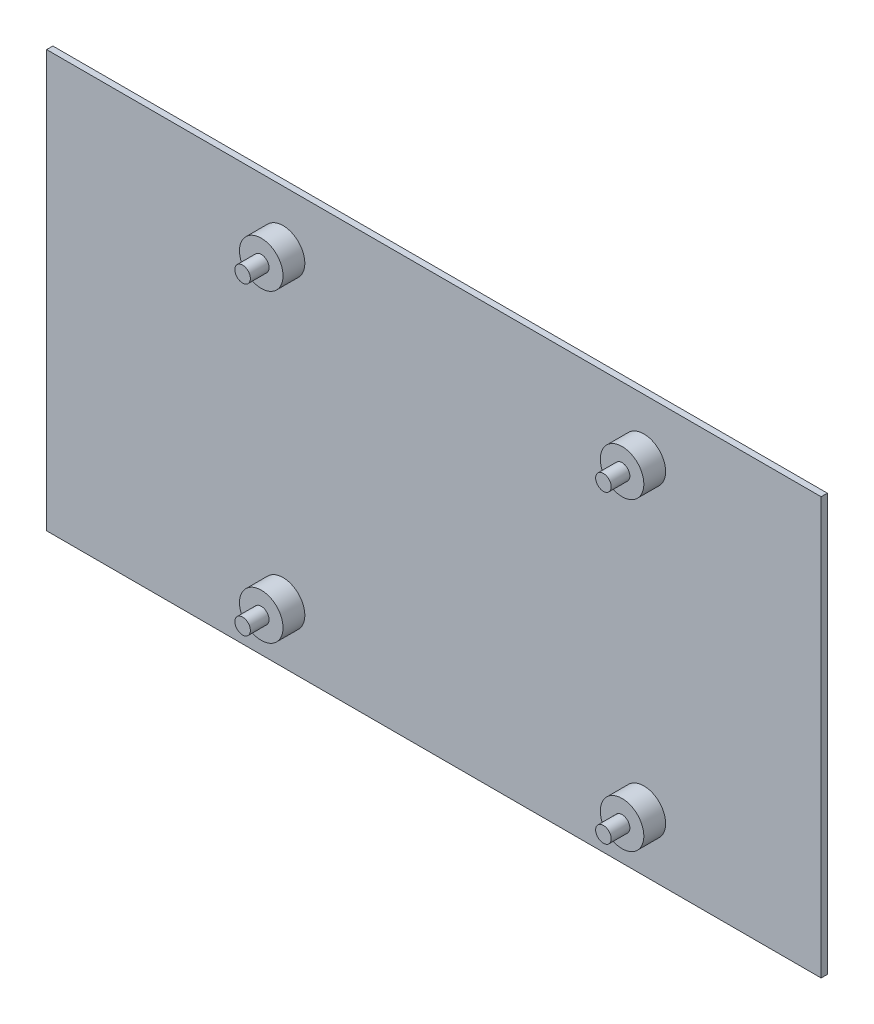
ISO-10303-21;
HEADER;
FILE_DESCRIPTION(('STEP AP214'),'2;1');
FILE_NAME('part.step','',(''),(''),'','','');
FILE_SCHEMA(('AUTOMOTIVE_DESIGN { 1 0 10303 214 1 1 1 1 }'));
ENDSEC;
DATA;
#1=APPLICATION_CONTEXT('core data for automotive mechanical design processes');
#2=APPLICATION_PROTOCOL_DEFINITION('international standard','automotive_design',2000,#1);
#3=PRODUCT_CONTEXT('',#1,'mechanical');
#4=PRODUCT('Part','Part','',(#3));
#5=PRODUCT_RELATED_PRODUCT_CATEGORY('part','',(#4));
#6=PRODUCT_DEFINITION_FORMATION('','',#4);
#7=PRODUCT_DEFINITION_CONTEXT('part definition',#1,'design');
#8=PRODUCT_DEFINITION('design','',#6,#7);
#9=PRODUCT_DEFINITION_SHAPE('','',#8);
#10=(LENGTH_UNIT() NAMED_UNIT(*) SI_UNIT(.MILLI.,.METRE.));
#11=(NAMED_UNIT(*) PLANE_ANGLE_UNIT() SI_UNIT($,.RADIAN.));
#12=(NAMED_UNIT(*) SI_UNIT($,.STERADIAN.) SOLID_ANGLE_UNIT());
#13=UNCERTAINTY_MEASURE_WITH_UNIT(LENGTH_MEASURE(1.E-05),#10,'distance_accuracy_value','');
#14=(GEOMETRIC_REPRESENTATION_CONTEXT(3) GLOBAL_UNCERTAINTY_ASSIGNED_CONTEXT((#13)) GLOBAL_UNIT_ASSIGNED_CONTEXT((#10,
#11,#12)) REPRESENTATION_CONTEXT('',''));
#15=CARTESIAN_POINT('',(0.,0.,0.));
#16=DIRECTION('',(0.,0.,1.));
#17=DIRECTION('',(1.,0.,0.));
#18=AXIS2_PLACEMENT_3D('',#15,#16,#17);
#19=CARTESIAN_POINT('',(-24.25,-24.5,4.5));
#20=DIRECTION('',(0.,0.,1.));
#21=DIRECTION('',(1.,0.,0.));
#22=AXIS2_PLACEMENT_3D('',#19,#20,#21);
#23=PLANE('',#22);
#24=CARTESIAN_POINT('',(-24.25,-24.5,4.5));
#25=DIRECTION('',(0.,0.,1.));
#26=DIRECTION('',(1.,0.,0.));
#27=AXIS2_PLACEMENT_3D('',#24,#25,#26);
#28=CIRCLE('',#27,3.5);
#29=CARTESIAN_POINT('',(-20.75,-24.5,4.5));
#30=VERTEX_POINT('',#29);
#31=EDGE_CURVE('E209',#30,#30,#28,.T.);
#32=ORIENTED_EDGE('',*,*,#31,.T.);
#33=EDGE_LOOP('',(#32));
#34=FACE_BOUND('',#33,.T.);
#35=CARTESIAN_POINT('',(-24.25,-24.5,4.5));
#36=DIRECTION('',(0.,0.,1.));
#37=DIRECTION('',(1.,0.,0.));
#38=AXIS2_PLACEMENT_3D('',#35,#36,#37);
#39=CIRCLE('',#38,1.25);
#40=CARTESIAN_POINT('',(-23.,-24.5,4.5));
#41=VERTEX_POINT('',#40);
#42=EDGE_CURVE('E189',#41,#41,#39,.T.);
#43=ORIENTED_EDGE('',*,*,#42,.F.);
#44=EDGE_LOOP('',(#43));
#45=FACE_BOUND('',#44,.T.);
#46=ADVANCED_FACE('F33',(#34,#45),#23,.T.);
#47=CARTESIAN_POINT('',(33.75,-24.5,4.5));
#48=DIRECTION('',(0.,0.,1.));
#49=DIRECTION('',(1.,0.,0.));
#50=AXIS2_PLACEMENT_3D('',#47,#48,#49);
#51=PLANE('',#50);
#52=CARTESIAN_POINT('',(33.75,-24.5,4.5));
#53=DIRECTION('',(0.,0.,1.));
#54=DIRECTION('',(1.,0.,0.));
#55=AXIS2_PLACEMENT_3D('',#52,#53,#54);
#56=CIRCLE('',#55,3.5);
#57=CARTESIAN_POINT('',(37.25,-24.5,4.5));
#58=VERTEX_POINT('',#57);
#59=EDGE_CURVE('E213',#58,#58,#56,.T.);
#60=ORIENTED_EDGE('',*,*,#59,.T.);
#61=EDGE_LOOP('',(#60));
#62=FACE_BOUND('',#61,.T.);
#63=CARTESIAN_POINT('',(33.75,-24.5,4.5));
#64=DIRECTION('',(0.,0.,1.));
#65=DIRECTION('',(1.,0.,0.));
#66=AXIS2_PLACEMENT_3D('',#63,#64,#65);
#67=CIRCLE('',#66,1.25);
#68=CARTESIAN_POINT('',(35.,-24.5,4.5));
#69=VERTEX_POINT('',#68);
#70=EDGE_CURVE('E188',#69,#69,#67,.T.);
#71=ORIENTED_EDGE('',*,*,#70,.F.);
#72=EDGE_LOOP('',(#71));
#73=FACE_BOUND('',#72,.T.);
#74=ADVANCED_FACE('F147',(#62,#73),#51,.T.);
#75=CARTESIAN_POINT('',(33.75,24.5,4.5));
#76=DIRECTION('',(0.,0.,1.));
#77=DIRECTION('',(1.,0.,0.));
#78=AXIS2_PLACEMENT_3D('',#75,#76,#77);
#79=PLANE('',#78);
#80=CARTESIAN_POINT('',(33.75,24.5,4.5));
#81=DIRECTION('',(0.,0.,1.));
#82=DIRECTION('',(1.,0.,0.));
#83=AXIS2_PLACEMENT_3D('',#80,#81,#82);
#84=CIRCLE('',#83,3.5);
#85=CARTESIAN_POINT('',(37.25,24.5,4.5));
#86=VERTEX_POINT('',#85);
#87=EDGE_CURVE('E216',#86,#86,#84,.T.);
#88=ORIENTED_EDGE('',*,*,#87,.T.);
#89=EDGE_LOOP('',(#88));
#90=FACE_BOUND('',#89,.T.);
#91=CARTESIAN_POINT('',(33.75,24.5,4.5));
#92=DIRECTION('',(0.,0.,1.));
#93=DIRECTION('',(1.,0.,0.));
#94=AXIS2_PLACEMENT_3D('',#91,#92,#93);
#95=CIRCLE('',#94,1.25);
#96=CARTESIAN_POINT('',(35.,24.5,4.5));
#97=VERTEX_POINT('',#96);
#98=EDGE_CURVE('E198',#97,#97,#95,.T.);
#99=ORIENTED_EDGE('',*,*,#98,.F.);
#100=EDGE_LOOP('',(#99));
#101=FACE_BOUND('',#100,.T.);
#102=ADVANCED_FACE('F152',(#90,#101),#79,.T.);
#103=CARTESIAN_POINT('',(-24.25,24.5,4.5));
#104=DIRECTION('',(0.,0.,1.));
#105=DIRECTION('',(1.,0.,0.));
#106=AXIS2_PLACEMENT_3D('',#103,#104,#105);
#107=PLANE('',#106);
#108=CARTESIAN_POINT('',(-24.25,24.5,4.5));
#109=DIRECTION('',(0.,0.,1.));
#110=DIRECTION('',(1.,0.,0.));
#111=AXIS2_PLACEMENT_3D('',#108,#109,#110);
#112=CIRCLE('',#111,3.5);
#113=CARTESIAN_POINT('',(-20.75,24.5,4.5));
#114=VERTEX_POINT('',#113);
#115=EDGE_CURVE('E105',#114,#114,#112,.T.);
#116=ORIENTED_EDGE('',*,*,#115,.T.);
#117=EDGE_LOOP('',(#116));
#118=FACE_BOUND('',#117,.T.);
#119=CARTESIAN_POINT('',(-24.25,24.5,4.5));
#120=DIRECTION('',(0.,0.,1.));
#121=DIRECTION('',(1.,0.,0.));
#122=AXIS2_PLACEMENT_3D('',#119,#120,#121);
#123=CIRCLE('',#122,1.25);
#124=CARTESIAN_POINT('',(-23.,24.5,4.5));
#125=VERTEX_POINT('',#124);
#126=EDGE_CURVE('E203',#125,#125,#123,.T.);
#127=ORIENTED_EDGE('',*,*,#126,.F.);
#128=EDGE_LOOP('',(#127));
#129=FACE_BOUND('',#128,.T.);
#130=ADVANCED_FACE('F124',(#118,#129),#107,.T.);
#131=CARTESIAN_POINT('',(0.,0.,1.));
#132=DIRECTION('',(0.,0.,-1.));
#133=DIRECTION('',(-1.,0.,0.));
#134=AXIS2_PLACEMENT_3D('',#131,#132,#133);
#135=PLANE('',#134);
#136=DIRECTION('',(0.,-1.,0.));
#137=VECTOR('',#136,1.);
#138=CARTESIAN_POINT('',(-62.25,33.5,1.));
#139=LINE('',#138,#137);
#140=CARTESIAN_POINT('',(-62.25,33.5,1.));
#141=VERTEX_POINT('',#140);
#142=CARTESIAN_POINT('',(-62.25,-33.5,1.));
#143=VERTEX_POINT('',#142);
#144=EDGE_CURVE('E87',#141,#143,#139,.T.);
#145=ORIENTED_EDGE('',*,*,#144,.T.);
#146=DIRECTION('',(1.,0.,0.));
#147=VECTOR('',#146,1.);
#148=CARTESIAN_POINT('',(62.25,-33.5,1.));
#149=LINE('',#148,#147);
#150=CARTESIAN_POINT('',(62.25,-33.5,1.));
#151=VERTEX_POINT('',#150);
#152=EDGE_CURVE('E81',#143,#151,#149,.T.);
#153=ORIENTED_EDGE('',*,*,#152,.T.);
#154=DIRECTION('',(0.,1.,0.));
#155=VECTOR('',#154,1.);
#156=CARTESIAN_POINT('',(62.25,33.5,1.));
#157=LINE('',#156,#155);
#158=CARTESIAN_POINT('',(62.25,33.5,1.));
#159=VERTEX_POINT('',#158);
#160=EDGE_CURVE('E85',#151,#159,#157,.T.);
#161=ORIENTED_EDGE('',*,*,#160,.T.);
#162=DIRECTION('',(-1.,0.,0.));
#163=VECTOR('',#162,1.);
#164=CARTESIAN_POINT('',(62.25,33.5,1.));
#165=LINE('',#164,#163);
#166=EDGE_CURVE('E50',#159,#141,#165,.T.);
#167=ORIENTED_EDGE('',*,*,#166,.T.);
#168=EDGE_LOOP('',(#145,#153,#161,#167));
#169=FACE_BOUND('',#168,.T.);
#170=CARTESIAN_POINT('',(-24.25,24.5,1.));
#171=DIRECTION('',(0.,0.,-1.));
#172=DIRECTION('',(-1.,0.,0.));
#173=AXIS2_PLACEMENT_3D('',#170,#171,#172);
#174=CIRCLE('',#173,3.5);
#175=CARTESIAN_POINT('',(-27.75,24.5,1.));
#176=VERTEX_POINT('',#175);
#177=EDGE_CURVE('E112',#176,#176,#174,.F.);
#178=ORIENTED_EDGE('',*,*,#177,.F.);
#179=EDGE_LOOP('',(#178));
#180=FACE_BOUND('',#179,.T.);
#181=CARTESIAN_POINT('',(33.75,24.5,1.));
#182=DIRECTION('',(0.,0.,-1.));
#183=DIRECTION('',(-1.,0.,0.));
#184=AXIS2_PLACEMENT_3D('',#181,#182,#183);
#185=CIRCLE('',#184,3.5);
#186=CARTESIAN_POINT('',(30.25,24.5,1.));
#187=VERTEX_POINT('',#186);
#188=EDGE_CURVE('E115',#187,#187,#185,.F.);
#189=ORIENTED_EDGE('',*,*,#188,.F.);
#190=EDGE_LOOP('',(#189));
#191=FACE_BOUND('',#190,.T.);
#192=CARTESIAN_POINT('',(33.75,-24.5,1.));
#193=DIRECTION('',(0.,0.,-1.));
#194=DIRECTION('',(-1.,0.,0.));
#195=AXIS2_PLACEMENT_3D('',#192,#193,#194);
#196=CIRCLE('',#195,3.5);
#197=CARTESIAN_POINT('',(30.25,-24.5,1.));
#198=VERTEX_POINT('',#197);
#199=EDGE_CURVE('E42',#198,#198,#196,.F.);
#200=ORIENTED_EDGE('',*,*,#199,.F.);
#201=EDGE_LOOP('',(#200));
#202=FACE_BOUND('',#201,.T.);
#203=CARTESIAN_POINT('',(-24.25,-24.5,1.));
#204=DIRECTION('',(0.,0.,-1.));
#205=DIRECTION('',(-1.,0.,0.));
#206=AXIS2_PLACEMENT_3D('',#203,#204,#205);
#207=CIRCLE('',#206,3.5);
#208=CARTESIAN_POINT('',(-27.75,-24.5,1.));
#209=VERTEX_POINT('',#208);
#210=EDGE_CURVE('E11',#209,#209,#207,.F.);
#211=ORIENTED_EDGE('',*,*,#210,.F.);
#212=EDGE_LOOP('',(#211));
#213=FACE_BOUND('',#212,.T.);
#214=ADVANCED_FACE('F82',(#169,#180,#191,#202,#213),#135,.F.);
#215=CARTESIAN_POINT('',(-62.25,33.5,1.));
#216=DIRECTION('',(1.,0.,0.));
#217=DIRECTION('',(0.,1.,0.));
#218=AXIS2_PLACEMENT_3D('',#215,#216,#217);
#219=PLANE('',#218);
#220=DIRECTION('',(0.,-1.,0.));
#221=VECTOR('',#220,1.);
#222=CARTESIAN_POINT('',(-62.25,33.5,0.));
#223=LINE('',#222,#221);
#224=CARTESIAN_POINT('',(-62.25,33.5,0.));
#225=VERTEX_POINT('',#224);
#226=CARTESIAN_POINT('',(-62.25,-33.5,0.));
#227=VERTEX_POINT('',#226);
#228=EDGE_CURVE('E102',#225,#227,#223,.T.);
#229=ORIENTED_EDGE('',*,*,#228,.T.);
#230=DIRECTION('',(0.,0.,-1.));
#231=VECTOR('',#230,1.);
#232=CARTESIAN_POINT('',(-62.25,-33.5,1.));
#233=LINE('',#232,#231);
#234=EDGE_CURVE('E93',#143,#227,#233,.T.);
#235=ORIENTED_EDGE('',*,*,#234,.F.);
#236=ORIENTED_EDGE('',*,*,#144,.F.);
#237=DIRECTION('',(0.,0.,-1.));
#238=VECTOR('',#237,1.);
#239=CARTESIAN_POINT('',(-62.25,33.5,1.));
#240=LINE('',#239,#238);
#241=EDGE_CURVE('E98',#141,#225,#240,.T.);
#242=ORIENTED_EDGE('',*,*,#241,.T.);
#243=EDGE_LOOP('',(#229,#235,#236,#242));
#244=FACE_BOUND('',#243,.T.);
#245=ADVANCED_FACE('F35',(#244),#219,.F.);
#246=CARTESIAN_POINT('',(62.25,-33.5,1.));
#247=DIRECTION('',(0.,1.,0.));
#248=DIRECTION('',(-1.,0.,0.));
#249=AXIS2_PLACEMENT_3D('',#246,#247,#248);
#250=PLANE('',#249);
#251=DIRECTION('',(1.,0.,0.));
#252=VECTOR('',#251,1.);
#253=CARTESIAN_POINT('',(62.25,-33.5,0.));
#254=LINE('',#253,#252);
#255=CARTESIAN_POINT('',(62.25,-33.5,0.));
#256=VERTEX_POINT('',#255);
#257=EDGE_CURVE('E92',#227,#256,#254,.T.);
#258=ORIENTED_EDGE('',*,*,#257,.T.);
#259=DIRECTION('',(0.,0.,-1.));
#260=VECTOR('',#259,1.);
#261=CARTESIAN_POINT('',(62.25,-33.5,1.));
#262=LINE('',#261,#260);
#263=EDGE_CURVE('E90',#151,#256,#262,.T.);
#264=ORIENTED_EDGE('',*,*,#263,.F.);
#265=ORIENTED_EDGE('',*,*,#152,.F.);
#266=ORIENTED_EDGE('',*,*,#234,.T.);
#267=EDGE_LOOP('',(#258,#264,#265,#266));
#268=FACE_BOUND('',#267,.T.);
#269=ADVANCED_FACE('F91',(#268),#250,.F.);
#270=CARTESIAN_POINT('',(62.25,33.5,1.));
#271=DIRECTION('',(-1.,0.,0.));
#272=DIRECTION('',(0.,-1.,0.));
#273=AXIS2_PLACEMENT_3D('',#270,#271,#272);
#274=PLANE('',#273);
#275=DIRECTION('',(0.,1.,0.));
#276=VECTOR('',#275,1.);
#277=CARTESIAN_POINT('',(62.25,33.5,0.));
#278=LINE('',#277,#276);
#279=CARTESIAN_POINT('',(62.25,33.5,0.));
#280=VERTEX_POINT('',#279);
#281=EDGE_CURVE('E67',#256,#280,#278,.T.);
#282=ORIENTED_EDGE('',*,*,#281,.T.);
#283=DIRECTION('',(0.,0.,-1.));
#284=VECTOR('',#283,1.);
#285=CARTESIAN_POINT('',(62.25,33.5,1.));
#286=LINE('',#285,#284);
#287=EDGE_CURVE('E94',#159,#280,#286,.T.);
#288=ORIENTED_EDGE('',*,*,#287,.F.);
#289=ORIENTED_EDGE('',*,*,#160,.F.);
#290=ORIENTED_EDGE('',*,*,#263,.T.);
#291=EDGE_LOOP('',(#282,#288,#289,#290));
#292=FACE_BOUND('',#291,.T.);
#293=ADVANCED_FACE('F96',(#292),#274,.F.);
#294=CARTESIAN_POINT('',(62.25,33.5,1.));
#295=DIRECTION('',(0.,-1.,0.));
#296=DIRECTION('',(1.,0.,0.));
#297=AXIS2_PLACEMENT_3D('',#294,#295,#296);
#298=PLANE('',#297);
#299=DIRECTION('',(-1.,0.,0.));
#300=VECTOR('',#299,1.);
#301=CARTESIAN_POINT('',(62.25,33.5,0.));
#302=LINE('',#301,#300);
#303=EDGE_CURVE('E73',#280,#225,#302,.T.);
#304=ORIENTED_EDGE('',*,*,#303,.T.);
#305=ORIENTED_EDGE('',*,*,#241,.F.);
#306=ORIENTED_EDGE('',*,*,#166,.F.);
#307=ORIENTED_EDGE('',*,*,#287,.T.);
#308=EDGE_LOOP('',(#304,#305,#306,#307));
#309=FACE_BOUND('',#308,.T.);
#310=ADVANCED_FACE('F245',(#309),#298,.F.);
#311=CARTESIAN_POINT('',(0.,0.,0.));
#312=DIRECTION('',(0.,0.,-1.));
#313=DIRECTION('',(-1.,0.,0.));
#314=AXIS2_PLACEMENT_3D('',#311,#312,#313);
#315=PLANE('',#314);
#316=ORIENTED_EDGE('',*,*,#228,.F.);
#317=ORIENTED_EDGE('',*,*,#303,.F.);
#318=ORIENTED_EDGE('',*,*,#281,.F.);
#319=ORIENTED_EDGE('',*,*,#257,.F.);
#320=EDGE_LOOP('',(#316,#317,#318,#319));
#321=FACE_BOUND('',#320,.T.);
#322=ADVANCED_FACE('F227',(#321),#315,.T.);
#323=CARTESIAN_POINT('',(-24.25,24.5,4.5));
#324=DIRECTION('',(0.,0.,-1.));
#325=DIRECTION('',(-1.,0.,0.));
#326=AXIS2_PLACEMENT_3D('',#323,#324,#325);
#327=CYLINDRICAL_SURFACE('',#326,3.5);
#328=ORIENTED_EDGE('',*,*,#115,.F.);
#329=EDGE_LOOP('',(#328));
#330=FACE_BOUND('',#329,.T.);
#331=ORIENTED_EDGE('',*,*,#177,.T.);
#332=EDGE_LOOP('',(#331));
#333=FACE_BOUND('',#332,.T.);
#334=ADVANCED_FACE('F224',(#330,#333),#327,.T.);
#335=CARTESIAN_POINT('',(33.75,24.5,4.5));
#336=DIRECTION('',(0.,0.,-1.));
#337=DIRECTION('',(-1.,0.,0.));
#338=AXIS2_PLACEMENT_3D('',#335,#336,#337);
#339=CYLINDRICAL_SURFACE('',#338,3.5);
#340=ORIENTED_EDGE('',*,*,#87,.F.);
#341=EDGE_LOOP('',(#340));
#342=FACE_BOUND('',#341,.T.);
#343=ORIENTED_EDGE('',*,*,#188,.T.);
#344=EDGE_LOOP('',(#343));
#345=FACE_BOUND('',#344,.T.);
#346=ADVANCED_FACE('F140',(#342,#345),#339,.T.);
#347=CARTESIAN_POINT('',(33.75,-24.5,4.5));
#348=DIRECTION('',(0.,0.,-1.));
#349=DIRECTION('',(-1.,0.,0.));
#350=AXIS2_PLACEMENT_3D('',#347,#348,#349);
#351=CYLINDRICAL_SURFACE('',#350,3.5);
#352=ORIENTED_EDGE('',*,*,#59,.F.);
#353=EDGE_LOOP('',(#352));
#354=FACE_BOUND('',#353,.T.);
#355=ORIENTED_EDGE('',*,*,#199,.T.);
#356=EDGE_LOOP('',(#355));
#357=FACE_BOUND('',#356,.T.);
#358=ADVANCED_FACE('F120',(#354,#357),#351,.T.);
#359=CARTESIAN_POINT('',(-24.25,-24.5,4.5));
#360=DIRECTION('',(0.,0.,-1.));
#361=DIRECTION('',(-1.,0.,0.));
#362=AXIS2_PLACEMENT_3D('',#359,#360,#361);
#363=CYLINDRICAL_SURFACE('',#362,3.5);
#364=ORIENTED_EDGE('',*,*,#31,.F.);
#365=EDGE_LOOP('',(#364));
#366=FACE_BOUND('',#365,.T.);
#367=ORIENTED_EDGE('',*,*,#210,.T.);
#368=EDGE_LOOP('',(#367));
#369=FACE_BOUND('',#368,.T.);
#370=ADVANCED_FACE('F128',(#366,#369),#363,.T.);
#371=CARTESIAN_POINT('',(-24.25,24.5,7.5));
#372=DIRECTION('',(0.,0.,-1.));
#373=DIRECTION('',(-1.,0.,0.));
#374=AXIS2_PLACEMENT_3D('',#371,#372,#373);
#375=CYLINDRICAL_SURFACE('',#374,1.25);
#376=CARTESIAN_POINT('',(-24.25,24.5,7.5));
#377=DIRECTION('',(0.,0.,1.));
#378=DIRECTION('',(1.,0.,0.));
#379=AXIS2_PLACEMENT_3D('',#376,#377,#378);
#380=CIRCLE('',#379,1.25);
#381=CARTESIAN_POINT('',(-23.,24.5,7.5));
#382=VERTEX_POINT('',#381);
#383=EDGE_CURVE('E206',#382,#382,#380,.T.);
#384=ORIENTED_EDGE('',*,*,#383,.F.);
#385=EDGE_LOOP('',(#384));
#386=FACE_BOUND('',#385,.T.);
#387=ORIENTED_EDGE('',*,*,#126,.T.);
#388=EDGE_LOOP('',(#387));
#389=FACE_BOUND('',#388,.T.);
#390=ADVANCED_FACE('F130',(#386,#389),#375,.T.);
#391=CARTESIAN_POINT('',(-24.25,24.5,7.5));
#392=DIRECTION('',(0.,0.,1.));
#393=DIRECTION('',(1.,0.,0.));
#394=AXIS2_PLACEMENT_3D('',#391,#392,#393);
#395=PLANE('',#394);
#396=ORIENTED_EDGE('',*,*,#383,.T.);
#397=EDGE_LOOP('',(#396));
#398=FACE_BOUND('',#397,.T.);
#399=ADVANCED_FACE('F137',(#398),#395,.T.);
#400=CARTESIAN_POINT('',(33.75,24.5,7.5));
#401=DIRECTION('',(0.,0.,-1.));
#402=DIRECTION('',(-1.,0.,0.));
#403=AXIS2_PLACEMENT_3D('',#400,#401,#402);
#404=CYLINDRICAL_SURFACE('',#403,1.25);
#405=CARTESIAN_POINT('',(33.75,24.5,7.5));
#406=DIRECTION('',(0.,0.,1.));
#407=DIRECTION('',(1.,0.,0.));
#408=AXIS2_PLACEMENT_3D('',#405,#406,#407);
#409=CIRCLE('',#408,1.25);
#410=CARTESIAN_POINT('',(35.,24.5,7.5));
#411=VERTEX_POINT('',#410);
#412=EDGE_CURVE('E200',#411,#411,#409,.T.);
#413=ORIENTED_EDGE('',*,*,#412,.F.);
#414=EDGE_LOOP('',(#413));
#415=FACE_BOUND('',#414,.T.);
#416=ORIENTED_EDGE('',*,*,#98,.T.);
#417=EDGE_LOOP('',(#416));
#418=FACE_BOUND('',#417,.T.);
#419=ADVANCED_FACE('F159',(#415,#418),#404,.T.);
#420=CARTESIAN_POINT('',(33.75,24.5,7.5));
#421=DIRECTION('',(0.,0.,1.));
#422=DIRECTION('',(1.,0.,0.));
#423=AXIS2_PLACEMENT_3D('',#420,#421,#422);
#424=PLANE('',#423);
#425=ORIENTED_EDGE('',*,*,#412,.T.);
#426=EDGE_LOOP('',(#425));
#427=FACE_BOUND('',#426,.T.);
#428=ADVANCED_FACE('F163',(#427),#424,.T.);
#429=CARTESIAN_POINT('',(33.75,-24.5,7.5));
#430=DIRECTION('',(0.,0.,-1.));
#431=DIRECTION('',(-1.,0.,0.));
#432=AXIS2_PLACEMENT_3D('',#429,#430,#431);
#433=CYLINDRICAL_SURFACE('',#432,1.25);
#434=CARTESIAN_POINT('',(33.75,-24.5,7.5));
#435=DIRECTION('',(0.,0.,1.));
#436=DIRECTION('',(1.,0.,0.));
#437=AXIS2_PLACEMENT_3D('',#434,#435,#436);
#438=CIRCLE('',#437,1.25);
#439=CARTESIAN_POINT('',(35.,-24.5,7.5));
#440=VERTEX_POINT('',#439);
#441=EDGE_CURVE('E192',#440,#440,#438,.T.);
#442=ORIENTED_EDGE('',*,*,#441,.F.);
#443=EDGE_LOOP('',(#442));
#444=FACE_BOUND('',#443,.T.);
#445=ORIENTED_EDGE('',*,*,#70,.T.);
#446=EDGE_LOOP('',(#445));
#447=FACE_BOUND('',#446,.T.);
#448=ADVANCED_FACE('F167',(#444,#447),#433,.T.);
#449=CARTESIAN_POINT('',(33.75,-24.5,7.5));
#450=DIRECTION('',(0.,0.,1.));
#451=DIRECTION('',(1.,0.,0.));
#452=AXIS2_PLACEMENT_3D('',#449,#450,#451);
#453=PLANE('',#452);
#454=ORIENTED_EDGE('',*,*,#441,.T.);
#455=EDGE_LOOP('',(#454));
#456=FACE_BOUND('',#455,.T.);
#457=ADVANCED_FACE('F171',(#456),#453,.T.);
#458=CARTESIAN_POINT('',(-24.25,-24.5,7.5));
#459=DIRECTION('',(0.,0.,-1.));
#460=DIRECTION('',(-1.,0.,0.));
#461=AXIS2_PLACEMENT_3D('',#458,#459,#460);
#462=CYLINDRICAL_SURFACE('',#461,1.25);
#463=CARTESIAN_POINT('',(-24.25,-24.5,7.5));
#464=DIRECTION('',(0.,0.,1.));
#465=DIRECTION('',(1.,0.,0.));
#466=AXIS2_PLACEMENT_3D('',#463,#464,#465);
#467=CIRCLE('',#466,1.25);
#468=CARTESIAN_POINT('',(-23.,-24.5,7.5));
#469=VERTEX_POINT('',#468);
#470=EDGE_CURVE('E187',#469,#469,#467,.T.);
#471=ORIENTED_EDGE('',*,*,#470,.F.);
#472=EDGE_LOOP('',(#471));
#473=FACE_BOUND('',#472,.T.);
#474=ORIENTED_EDGE('',*,*,#42,.T.);
#475=EDGE_LOOP('',(#474));
#476=FACE_BOUND('',#475,.T.);
#477=ADVANCED_FACE('F175',(#473,#476),#462,.T.);
#478=CARTESIAN_POINT('',(-24.25,-24.5,7.5));
#479=DIRECTION('',(0.,0.,1.));
#480=DIRECTION('',(1.,0.,0.));
#481=AXIS2_PLACEMENT_3D('',#478,#479,#480);
#482=PLANE('',#481);
#483=ORIENTED_EDGE('',*,*,#470,.T.);
#484=EDGE_LOOP('',(#483));
#485=FACE_BOUND('',#484,.T.);
#486=ADVANCED_FACE('F179',(#485),#482,.T.);
#487=CLOSED_SHELL('',(#46,#74,#102,#130,#214,#245,#269,#293,#310,#322,#334,#346,#358,#370,#390,
#399,#419,#428,#448,#457,#477,#486));
#488=MANIFOLD_SOLID_BREP('B2',#487);
#489=ADVANCED_BREP_SHAPE_REPRESENTATION('',(#18,#488),#14);
#490=SHAPE_DEFINITION_REPRESENTATION(#9,#489);
ENDSEC;
END-ISO-10303-21;
